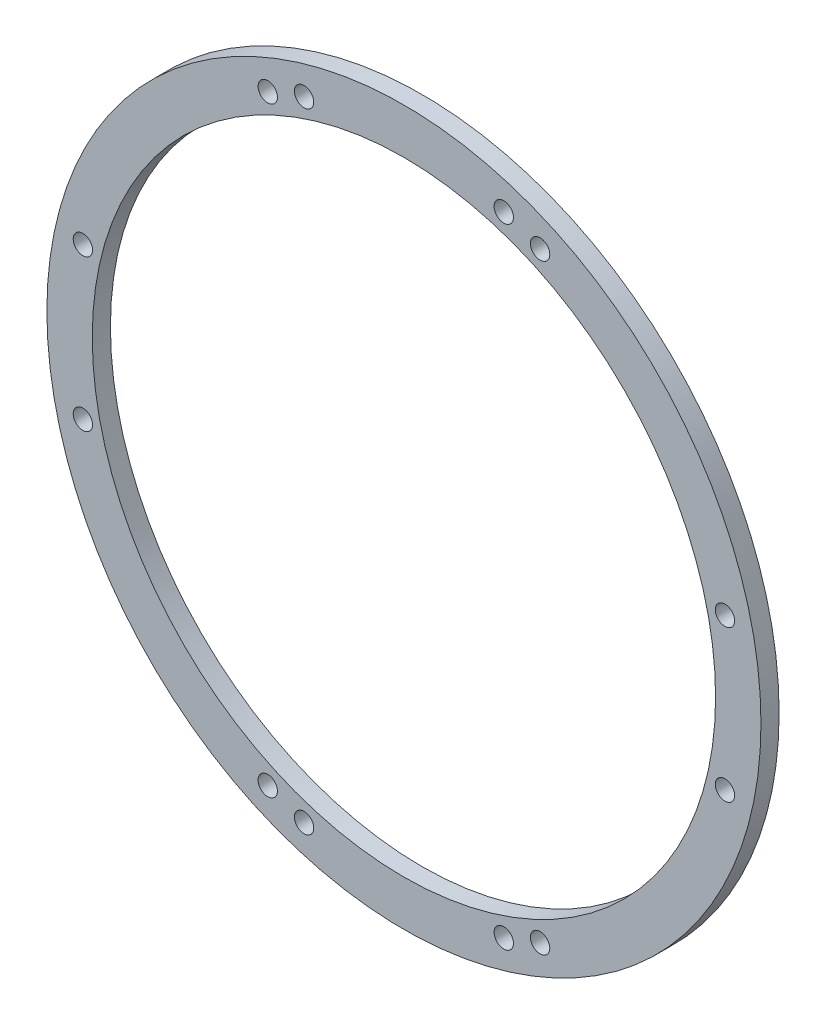
ISO-10303-21;
HEADER;
FILE_DESCRIPTION(('STEP AP214'),'2;1');
FILE_NAME('part.step','',(''),(''),'','','');
FILE_SCHEMA(('AUTOMOTIVE_DESIGN { 1 0 10303 214 1 1 1 1 }'));
ENDSEC;
DATA;
#1=APPLICATION_CONTEXT('core data for automotive mechanical design processes');
#2=APPLICATION_PROTOCOL_DEFINITION('international standard','automotive_design',2000,#1);
#3=PRODUCT_CONTEXT('',#1,'mechanical');
#4=PRODUCT('Part','Part','',(#3));
#5=PRODUCT_RELATED_PRODUCT_CATEGORY('part','',(#4));
#6=PRODUCT_DEFINITION_FORMATION('','',#4);
#7=PRODUCT_DEFINITION_CONTEXT('part definition',#1,'design');
#8=PRODUCT_DEFINITION('design','',#6,#7);
#9=PRODUCT_DEFINITION_SHAPE('','',#8);
#10=(LENGTH_UNIT() NAMED_UNIT(*) SI_UNIT(.MILLI.,.METRE.));
#11=(NAMED_UNIT(*) PLANE_ANGLE_UNIT() SI_UNIT($,.RADIAN.));
#12=(NAMED_UNIT(*) SI_UNIT($,.STERADIAN.) SOLID_ANGLE_UNIT());
#13=UNCERTAINTY_MEASURE_WITH_UNIT(LENGTH_MEASURE(1.E-05),#10,'distance_accuracy_value','');
#14=(GEOMETRIC_REPRESENTATION_CONTEXT(3) GLOBAL_UNCERTAINTY_ASSIGNED_CONTEXT((#13)) GLOBAL_UNIT_ASSIGNED_CONTEXT((#10,
#11,#12)) REPRESENTATION_CONTEXT('',''));
#15=CARTESIAN_POINT('',(0.,0.,0.));
#16=DIRECTION('',(0.,0.,1.));
#17=DIRECTION('',(1.,0.,0.));
#18=AXIS2_PLACEMENT_3D('',#15,#16,#17);
#19=CARTESIAN_POINT('',(0.,0.,3.));
#20=DIRECTION('',(0.,0.,1.));
#21=DIRECTION('',(1.,0.,0.));
#22=AXIS2_PLACEMENT_3D('',#19,#20,#21);
#23=PLANE('',#22);
#24=CARTESIAN_POINT('',(-22.5,49.6386945839634,3.));
#25=DIRECTION('',(0.,0.,1.));
#26=DIRECTION('',(-1.,0.,0.));
#27=AXIS2_PLACEMENT_3D('',#24,#25,#26);
#28=CIRCLE('',#27,1.6);
#29=CARTESIAN_POINT('',(-24.1,49.6386945839634,3.));
#30=VERTEX_POINT('',#29);
#31=EDGE_CURVE('E142',#30,#30,#28,.T.);
#32=ORIENTED_EDGE('',*,*,#31,.F.);
#33=EDGE_LOOP('',(#32));
#34=FACE_BOUND('',#33,.T.);
#35=CARTESIAN_POINT('',(-53.0471488394994,-12.5,3.));
#36=DIRECTION('',(0.,0.,1.));
#37=DIRECTION('',(1.,0.,0.));
#38=AXIS2_PLACEMENT_3D('',#35,#36,#37);
#39=CIRCLE('',#38,1.6);
#40=CARTESIAN_POINT('',(-51.4471488394994,-12.5,3.));
#41=VERTEX_POINT('',#40);
#42=EDGE_CURVE('E126',#41,#41,#39,.T.);
#43=ORIENTED_EDGE('',*,*,#42,.F.);
#44=EDGE_LOOP('',(#43));
#45=FACE_BOUND('',#44,.T.);
#46=CARTESIAN_POINT('',(-16.5,-51.9422756528822,3.));
#47=DIRECTION('',(0.,0.,1.));
#48=DIRECTION('',(1.,0.,0.));
#49=AXIS2_PLACEMENT_3D('',#46,#47,#48);
#50=CIRCLE('',#49,1.6);
#51=CARTESIAN_POINT('',(-14.9,-51.9422756528822,3.));
#52=VERTEX_POINT('',#51);
#53=EDGE_CURVE('E110',#52,#52,#50,.T.);
#54=ORIENTED_EDGE('',*,*,#53,.F.);
#55=EDGE_LOOP('',(#54));
#56=FACE_BOUND('',#55,.T.);
#57=CARTESIAN_POINT('',(16.5,-51.9422756528822,3.));
#58=DIRECTION('',(0.,0.,1.));
#59=DIRECTION('',(-1.,0.,0.));
#60=AXIS2_PLACEMENT_3D('',#57,#58,#59);
#61=CIRCLE('',#60,1.60000000000001);
#62=CARTESIAN_POINT('',(14.9,-51.9422756528822,3.));
#63=VERTEX_POINT('',#62);
#64=EDGE_CURVE('E94',#63,#63,#61,.T.);
#65=ORIENTED_EDGE('',*,*,#64,.F.);
#66=EDGE_LOOP('',(#65));
#67=FACE_BOUND('',#66,.T.);
#68=CARTESIAN_POINT('',(53.0471488394994,12.5,3.));
#69=DIRECTION('',(0.,0.,1.));
#70=DIRECTION('',(1.,0.,0.));
#71=AXIS2_PLACEMENT_3D('',#68,#69,#70);
#72=CIRCLE('',#71,1.6);
#73=CARTESIAN_POINT('',(54.6471488394994,12.5,3.));
#74=VERTEX_POINT('',#73);
#75=EDGE_CURVE('E78',#74,#74,#72,.T.);
#76=ORIENTED_EDGE('',*,*,#75,.F.);
#77=EDGE_LOOP('',(#76));
#78=FACE_BOUND('',#77,.T.);
#79=CARTESIAN_POINT('',(16.5,51.9422756528822,3.));
#80=DIRECTION('',(0.,0.,1.));
#81=DIRECTION('',(1.,0.,0.));
#82=AXIS2_PLACEMENT_3D('',#79,#80,#81);
#83=CIRCLE('',#82,1.60000000000001);
#84=CARTESIAN_POINT('',(18.1,51.9422756528822,3.));
#85=VERTEX_POINT('',#84);
#86=EDGE_CURVE('E62',#85,#85,#83,.T.);
#87=ORIENTED_EDGE('',*,*,#86,.F.);
#88=EDGE_LOOP('',(#87));
#89=FACE_BOUND('',#88,.T.);
#90=CARTESIAN_POINT('',(0.,0.,3.));
#91=DIRECTION('',(0.,0.,1.));
#92=DIRECTION('',(1.,0.,0.));
#93=AXIS2_PLACEMENT_3D('',#90,#91,#92);
#94=CIRCLE('',#93,59.);
#95=CARTESIAN_POINT('',(59.,0.,3.));
#96=VERTEX_POINT('',#95);
#97=EDGE_CURVE('E10',#96,#96,#94,.T.);
#98=ORIENTED_EDGE('',*,*,#97,.T.);
#99=EDGE_LOOP('',(#98));
#100=FACE_BOUND('',#99,.T.);
#101=CARTESIAN_POINT('',(0.,0.,3.));
#102=DIRECTION('',(0.,0.,1.));
#103=DIRECTION('',(1.,0.,0.));
#104=AXIS2_PLACEMENT_3D('',#101,#102,#103);
#105=CIRCLE('',#104,51.5);
#106=CARTESIAN_POINT('',(51.5,0.,3.));
#107=VERTEX_POINT('',#106);
#108=EDGE_CURVE('E56',#107,#107,#105,.T.);
#109=ORIENTED_EDGE('',*,*,#108,.F.);
#110=EDGE_LOOP('',(#109));
#111=FACE_BOUND('',#110,.T.);
#112=CARTESIAN_POINT('',(22.5,49.6386945839634,3.));
#113=DIRECTION('',(0.,0.,1.));
#114=DIRECTION('',(1.,0.,0.));
#115=AXIS2_PLACEMENT_3D('',#112,#113,#114);
#116=CIRCLE('',#115,1.6);
#117=CARTESIAN_POINT('',(24.1,49.6386945839634,3.));
#118=VERTEX_POINT('',#117);
#119=EDGE_CURVE('E70',#118,#118,#116,.T.);
#120=ORIENTED_EDGE('',*,*,#119,.F.);
#121=EDGE_LOOP('',(#120));
#122=FACE_BOUND('',#121,.T.);
#123=CARTESIAN_POINT('',(22.5,-49.6386945839634,3.));
#124=DIRECTION('',(0.,0.,1.));
#125=DIRECTION('',(-1.,0.,0.));
#126=AXIS2_PLACEMENT_3D('',#123,#124,#125);
#127=CIRCLE('',#126,1.6);
#128=CARTESIAN_POINT('',(20.9,-49.6386945839634,3.));
#129=VERTEX_POINT('',#128);
#130=EDGE_CURVE('E86',#129,#129,#127,.T.);
#131=ORIENTED_EDGE('',*,*,#130,.F.);
#132=EDGE_LOOP('',(#131));
#133=FACE_BOUND('',#132,.T.);
#134=CARTESIAN_POINT('',(53.0471488394994,-12.5,3.));
#135=DIRECTION('',(0.,0.,1.));
#136=DIRECTION('',(-1.,0.,0.));
#137=AXIS2_PLACEMENT_3D('',#134,#135,#136);
#138=CIRCLE('',#137,1.6);
#139=CARTESIAN_POINT('',(51.4471488394994,-12.5,3.));
#140=VERTEX_POINT('',#139);
#141=EDGE_CURVE('E102',#140,#140,#138,.T.);
#142=ORIENTED_EDGE('',*,*,#141,.F.);
#143=EDGE_LOOP('',(#142));
#144=FACE_BOUND('',#143,.T.);
#145=CARTESIAN_POINT('',(-22.5,-49.6386945839634,3.));
#146=DIRECTION('',(0.,0.,1.));
#147=DIRECTION('',(1.,0.,0.));
#148=AXIS2_PLACEMENT_3D('',#145,#146,#147);
#149=CIRCLE('',#148,1.6);
#150=CARTESIAN_POINT('',(-20.9,-49.6386945839634,3.));
#151=VERTEX_POINT('',#150);
#152=EDGE_CURVE('E118',#151,#151,#149,.T.);
#153=ORIENTED_EDGE('',*,*,#152,.F.);
#154=EDGE_LOOP('',(#153));
#155=FACE_BOUND('',#154,.T.);
#156=CARTESIAN_POINT('',(-53.0471488394994,12.5,3.));
#157=DIRECTION('',(0.,0.,1.));
#158=DIRECTION('',(-1.,0.,0.));
#159=AXIS2_PLACEMENT_3D('',#156,#157,#158);
#160=CIRCLE('',#159,1.6);
#161=CARTESIAN_POINT('',(-54.6471488394994,12.5,3.));
#162=VERTEX_POINT('',#161);
#163=EDGE_CURVE('E134',#162,#162,#160,.T.);
#164=ORIENTED_EDGE('',*,*,#163,.F.);
#165=EDGE_LOOP('',(#164));
#166=FACE_BOUND('',#165,.T.);
#167=CARTESIAN_POINT('',(-16.5,51.9422756528822,3.));
#168=DIRECTION('',(0.,0.,1.));
#169=DIRECTION('',(-1.,0.,0.));
#170=AXIS2_PLACEMENT_3D('',#167,#168,#169);
#171=CIRCLE('',#170,1.6);
#172=CARTESIAN_POINT('',(-18.1,51.9422756528822,3.));
#173=VERTEX_POINT('',#172);
#174=EDGE_CURVE('E150',#173,#173,#171,.T.);
#175=ORIENTED_EDGE('',*,*,#174,.F.);
#176=EDGE_LOOP('',(#175));
#177=FACE_BOUND('',#176,.T.);
#178=ADVANCED_FACE('F43',(#34,#45,#56,#67,#78,#89,#100,#111,#122,#133,#144,#155,#166,#177),#23,.T.);
#179=CARTESIAN_POINT('',(0.,0.,0.));
#180=DIRECTION('',(0.,0.,1.));
#181=DIRECTION('',(1.,0.,0.));
#182=AXIS2_PLACEMENT_3D('',#179,#180,#181);
#183=PLANE('',#182);
#184=CARTESIAN_POINT('',(0.,0.,0.));
#185=DIRECTION('',(0.,0.,1.));
#186=DIRECTION('',(1.,0.,0.));
#187=AXIS2_PLACEMENT_3D('',#184,#185,#186);
#188=CIRCLE('',#187,59.);
#189=CARTESIAN_POINT('',(59.,0.,0.));
#190=VERTEX_POINT('',#189);
#191=EDGE_CURVE('E47',#190,#190,#188,.T.);
#192=ORIENTED_EDGE('',*,*,#191,.F.);
#193=EDGE_LOOP('',(#192));
#194=FACE_BOUND('',#193,.T.);
#195=CARTESIAN_POINT('',(0.,0.,0.));
#196=DIRECTION('',(0.,0.,1.));
#197=DIRECTION('',(1.,0.,0.));
#198=AXIS2_PLACEMENT_3D('',#195,#196,#197);
#199=CIRCLE('',#198,51.5);
#200=CARTESIAN_POINT('',(51.5,0.,0.));
#201=VERTEX_POINT('',#200);
#202=EDGE_CURVE('E58',#201,#201,#199,.T.);
#203=ORIENTED_EDGE('',*,*,#202,.T.);
#204=EDGE_LOOP('',(#203));
#205=FACE_BOUND('',#204,.T.);
#206=CARTESIAN_POINT('',(16.5,51.9422756528822,0.));
#207=DIRECTION('',(0.,0.,1.));
#208=DIRECTION('',(1.,0.,0.));
#209=AXIS2_PLACEMENT_3D('',#206,#207,#208);
#210=CIRCLE('',#209,1.60000000000001);
#211=CARTESIAN_POINT('',(18.1,51.9422756528822,0.));
#212=VERTEX_POINT('',#211);
#213=EDGE_CURVE('E66',#212,#212,#210,.T.);
#214=ORIENTED_EDGE('',*,*,#213,.T.);
#215=EDGE_LOOP('',(#214));
#216=FACE_BOUND('',#215,.T.);
#217=CARTESIAN_POINT('',(22.5,49.6386945839634,0.));
#218=DIRECTION('',(0.,0.,1.));
#219=DIRECTION('',(1.,0.,0.));
#220=AXIS2_PLACEMENT_3D('',#217,#218,#219);
#221=CIRCLE('',#220,1.6);
#222=CARTESIAN_POINT('',(24.1,49.6386945839634,0.));
#223=VERTEX_POINT('',#222);
#224=EDGE_CURVE('E74',#223,#223,#221,.T.);
#225=ORIENTED_EDGE('',*,*,#224,.T.);
#226=EDGE_LOOP('',(#225));
#227=FACE_BOUND('',#226,.T.);
#228=CARTESIAN_POINT('',(53.0471488394994,12.5,0.));
#229=DIRECTION('',(0.,0.,1.));
#230=DIRECTION('',(1.,0.,0.));
#231=AXIS2_PLACEMENT_3D('',#228,#229,#230);
#232=CIRCLE('',#231,1.6);
#233=CARTESIAN_POINT('',(54.6471488394994,12.5,0.));
#234=VERTEX_POINT('',#233);
#235=EDGE_CURVE('E82',#234,#234,#232,.T.);
#236=ORIENTED_EDGE('',*,*,#235,.T.);
#237=EDGE_LOOP('',(#236));
#238=FACE_BOUND('',#237,.T.);
#239=CARTESIAN_POINT('',(22.5,-49.6386945839634,0.));
#240=DIRECTION('',(0.,0.,1.));
#241=DIRECTION('',(-1.,0.,0.));
#242=AXIS2_PLACEMENT_3D('',#239,#240,#241);
#243=CIRCLE('',#242,1.6);
#244=CARTESIAN_POINT('',(20.9,-49.6386945839634,0.));
#245=VERTEX_POINT('',#244);
#246=EDGE_CURVE('E90',#245,#245,#243,.T.);
#247=ORIENTED_EDGE('',*,*,#246,.T.);
#248=EDGE_LOOP('',(#247));
#249=FACE_BOUND('',#248,.T.);
#250=CARTESIAN_POINT('',(16.5,-51.9422756528822,0.));
#251=DIRECTION('',(0.,0.,1.));
#252=DIRECTION('',(-1.,0.,0.));
#253=AXIS2_PLACEMENT_3D('',#250,#251,#252);
#254=CIRCLE('',#253,1.60000000000001);
#255=CARTESIAN_POINT('',(14.9,-51.9422756528822,0.));
#256=VERTEX_POINT('',#255);
#257=EDGE_CURVE('E98',#256,#256,#254,.T.);
#258=ORIENTED_EDGE('',*,*,#257,.T.);
#259=EDGE_LOOP('',(#258));
#260=FACE_BOUND('',#259,.T.);
#261=CARTESIAN_POINT('',(53.0471488394994,-12.5,0.));
#262=DIRECTION('',(0.,0.,1.));
#263=DIRECTION('',(-1.,0.,0.));
#264=AXIS2_PLACEMENT_3D('',#261,#262,#263);
#265=CIRCLE('',#264,1.6);
#266=CARTESIAN_POINT('',(51.4471488394994,-12.5,0.));
#267=VERTEX_POINT('',#266);
#268=EDGE_CURVE('E106',#267,#267,#265,.T.);
#269=ORIENTED_EDGE('',*,*,#268,.T.);
#270=EDGE_LOOP('',(#269));
#271=FACE_BOUND('',#270,.T.);
#272=CARTESIAN_POINT('',(-16.5,-51.9422756528822,0.));
#273=DIRECTION('',(0.,0.,1.));
#274=DIRECTION('',(1.,0.,0.));
#275=AXIS2_PLACEMENT_3D('',#272,#273,#274);
#276=CIRCLE('',#275,1.6);
#277=CARTESIAN_POINT('',(-14.9,-51.9422756528822,0.));
#278=VERTEX_POINT('',#277);
#279=EDGE_CURVE('E114',#278,#278,#276,.T.);
#280=ORIENTED_EDGE('',*,*,#279,.T.);
#281=EDGE_LOOP('',(#280));
#282=FACE_BOUND('',#281,.T.);
#283=CARTESIAN_POINT('',(-22.5,-49.6386945839634,0.));
#284=DIRECTION('',(0.,0.,1.));
#285=DIRECTION('',(1.,0.,0.));
#286=AXIS2_PLACEMENT_3D('',#283,#284,#285);
#287=CIRCLE('',#286,1.6);
#288=CARTESIAN_POINT('',(-20.9,-49.6386945839634,0.));
#289=VERTEX_POINT('',#288);
#290=EDGE_CURVE('E122',#289,#289,#287,.T.);
#291=ORIENTED_EDGE('',*,*,#290,.T.);
#292=EDGE_LOOP('',(#291));
#293=FACE_BOUND('',#292,.T.);
#294=CARTESIAN_POINT('',(-53.0471488394994,-12.5,0.));
#295=DIRECTION('',(0.,0.,1.));
#296=DIRECTION('',(1.,0.,0.));
#297=AXIS2_PLACEMENT_3D('',#294,#295,#296);
#298=CIRCLE('',#297,1.6);
#299=CARTESIAN_POINT('',(-51.4471488394994,-12.5,0.));
#300=VERTEX_POINT('',#299);
#301=EDGE_CURVE('E130',#300,#300,#298,.T.);
#302=ORIENTED_EDGE('',*,*,#301,.T.);
#303=EDGE_LOOP('',(#302));
#304=FACE_BOUND('',#303,.T.);
#305=CARTESIAN_POINT('',(-53.0471488394994,12.5,0.));
#306=DIRECTION('',(0.,0.,1.));
#307=DIRECTION('',(-1.,0.,0.));
#308=AXIS2_PLACEMENT_3D('',#305,#306,#307);
#309=CIRCLE('',#308,1.6);
#310=CARTESIAN_POINT('',(-54.6471488394994,12.5,0.));
#311=VERTEX_POINT('',#310);
#312=EDGE_CURVE('E138',#311,#311,#309,.T.);
#313=ORIENTED_EDGE('',*,*,#312,.T.);
#314=EDGE_LOOP('',(#313));
#315=FACE_BOUND('',#314,.T.);
#316=CARTESIAN_POINT('',(-22.5,49.6386945839634,0.));
#317=DIRECTION('',(0.,0.,1.));
#318=DIRECTION('',(-1.,0.,0.));
#319=AXIS2_PLACEMENT_3D('',#316,#317,#318);
#320=CIRCLE('',#319,1.6);
#321=CARTESIAN_POINT('',(-24.1,49.6386945839634,0.));
#322=VERTEX_POINT('',#321);
#323=EDGE_CURVE('E146',#322,#322,#320,.T.);
#324=ORIENTED_EDGE('',*,*,#323,.T.);
#325=EDGE_LOOP('',(#324));
#326=FACE_BOUND('',#325,.T.);
#327=CARTESIAN_POINT('',(-16.5,51.9422756528822,0.));
#328=DIRECTION('',(0.,0.,1.));
#329=DIRECTION('',(-1.,0.,0.));
#330=AXIS2_PLACEMENT_3D('',#327,#328,#329);
#331=CIRCLE('',#330,1.6);
#332=CARTESIAN_POINT('',(-18.1,51.9422756528822,0.));
#333=VERTEX_POINT('',#332);
#334=EDGE_CURVE('E154',#333,#333,#331,.T.);
#335=ORIENTED_EDGE('',*,*,#334,.T.);
#336=EDGE_LOOP('',(#335));
#337=FACE_BOUND('',#336,.T.);
#338=ADVANCED_FACE('F166',(#194,#205,#216,#227,#238,#249,#260,#271,#282,#293,#304,#315,#326,
#337),#183,.F.);
#339=CARTESIAN_POINT('',(0.,0.,3.));
#340=DIRECTION('',(0.,0.,-1.));
#341=DIRECTION('',(-1.,0.,0.));
#342=AXIS2_PLACEMENT_3D('',#339,#340,#341);
#343=CYLINDRICAL_SURFACE('',#342,59.);
#344=ORIENTED_EDGE('',*,*,#97,.F.);
#345=EDGE_LOOP('',(#344));
#346=FACE_BOUND('',#345,.T.);
#347=ORIENTED_EDGE('',*,*,#191,.T.);
#348=EDGE_LOOP('',(#347));
#349=FACE_BOUND('',#348,.T.);
#350=ADVANCED_FACE('F45',(#346,#349),#343,.T.);
#351=CARTESIAN_POINT('',(0.,0.,3.));
#352=DIRECTION('',(0.,0.,-1.));
#353=DIRECTION('',(-1.,0.,0.));
#354=AXIS2_PLACEMENT_3D('',#351,#352,#353);
#355=CYLINDRICAL_SURFACE('',#354,51.5);
#356=ORIENTED_EDGE('',*,*,#108,.T.);
#357=EDGE_LOOP('',(#356));
#358=FACE_BOUND('',#357,.T.);
#359=ORIENTED_EDGE('',*,*,#202,.F.);
#360=EDGE_LOOP('',(#359));
#361=FACE_BOUND('',#360,.T.);
#362=ADVANCED_FACE('F176',(#358,#361),#355,.F.);
#363=CARTESIAN_POINT('',(16.5,51.9422756528822,3.));
#364=DIRECTION('',(0.,0.,-1.));
#365=DIRECTION('',(-1.,0.,0.));
#366=AXIS2_PLACEMENT_3D('',#363,#364,#365);
#367=CYLINDRICAL_SURFACE('',#366,1.60000000000001);
#368=ORIENTED_EDGE('',*,*,#86,.T.);
#369=EDGE_LOOP('',(#368));
#370=FACE_BOUND('',#369,.T.);
#371=ORIENTED_EDGE('',*,*,#213,.F.);
#372=EDGE_LOOP('',(#371));
#373=FACE_BOUND('',#372,.T.);
#374=ADVANCED_FACE('F179',(#370,#373),#367,.F.);
#375=CARTESIAN_POINT('',(22.5,49.6386945839634,3.));
#376=DIRECTION('',(0.,0.,-1.));
#377=DIRECTION('',(-1.,0.,0.));
#378=AXIS2_PLACEMENT_3D('',#375,#376,#377);
#379=CYLINDRICAL_SURFACE('',#378,1.6);
#380=ORIENTED_EDGE('',*,*,#119,.T.);
#381=EDGE_LOOP('',(#380));
#382=FACE_BOUND('',#381,.T.);
#383=ORIENTED_EDGE('',*,*,#224,.F.);
#384=EDGE_LOOP('',(#383));
#385=FACE_BOUND('',#384,.T.);
#386=ADVANCED_FACE('F183',(#382,#385),#379,.F.);
#387=CARTESIAN_POINT('',(53.0471488394994,12.5,3.));
#388=DIRECTION('',(0.,0.,-1.));
#389=DIRECTION('',(-1.,0.,0.));
#390=AXIS2_PLACEMENT_3D('',#387,#388,#389);
#391=CYLINDRICAL_SURFACE('',#390,1.6);
#392=ORIENTED_EDGE('',*,*,#75,.T.);
#393=EDGE_LOOP('',(#392));
#394=FACE_BOUND('',#393,.T.);
#395=ORIENTED_EDGE('',*,*,#235,.F.);
#396=EDGE_LOOP('',(#395));
#397=FACE_BOUND('',#396,.T.);
#398=ADVANCED_FACE('F187',(#394,#397),#391,.F.);
#399=CARTESIAN_POINT('',(22.5,-49.6386945839634,3.));
#400=DIRECTION('',(0.,0.,-1.));
#401=DIRECTION('',(-1.,0.,0.));
#402=AXIS2_PLACEMENT_3D('',#399,#400,#401);
#403=CYLINDRICAL_SURFACE('',#402,1.6);
#404=ORIENTED_EDGE('',*,*,#130,.T.);
#405=EDGE_LOOP('',(#404));
#406=FACE_BOUND('',#405,.T.);
#407=ORIENTED_EDGE('',*,*,#246,.F.);
#408=EDGE_LOOP('',(#407));
#409=FACE_BOUND('',#408,.T.);
#410=ADVANCED_FACE('F191',(#406,#409),#403,.F.);
#411=CARTESIAN_POINT('',(16.5,-51.9422756528822,3.));
#412=DIRECTION('',(0.,0.,-1.));
#413=DIRECTION('',(-1.,0.,0.));
#414=AXIS2_PLACEMENT_3D('',#411,#412,#413);
#415=CYLINDRICAL_SURFACE('',#414,1.60000000000001);
#416=ORIENTED_EDGE('',*,*,#64,.T.);
#417=EDGE_LOOP('',(#416));
#418=FACE_BOUND('',#417,.T.);
#419=ORIENTED_EDGE('',*,*,#257,.F.);
#420=EDGE_LOOP('',(#419));
#421=FACE_BOUND('',#420,.T.);
#422=ADVANCED_FACE('F195',(#418,#421),#415,.F.);
#423=CARTESIAN_POINT('',(53.0471488394994,-12.5,3.));
#424=DIRECTION('',(0.,0.,-1.));
#425=DIRECTION('',(-1.,0.,0.));
#426=AXIS2_PLACEMENT_3D('',#423,#424,#425);
#427=CYLINDRICAL_SURFACE('',#426,1.6);
#428=ORIENTED_EDGE('',*,*,#141,.T.);
#429=EDGE_LOOP('',(#428));
#430=FACE_BOUND('',#429,.T.);
#431=ORIENTED_EDGE('',*,*,#268,.F.);
#432=EDGE_LOOP('',(#431));
#433=FACE_BOUND('',#432,.T.);
#434=ADVANCED_FACE('F199',(#430,#433),#427,.F.);
#435=CARTESIAN_POINT('',(-16.5,-51.9422756528822,3.));
#436=DIRECTION('',(0.,0.,-1.));
#437=DIRECTION('',(-1.,0.,0.));
#438=AXIS2_PLACEMENT_3D('',#435,#436,#437);
#439=CYLINDRICAL_SURFACE('',#438,1.6);
#440=ORIENTED_EDGE('',*,*,#53,.T.);
#441=EDGE_LOOP('',(#440));
#442=FACE_BOUND('',#441,.T.);
#443=ORIENTED_EDGE('',*,*,#279,.F.);
#444=EDGE_LOOP('',(#443));
#445=FACE_BOUND('',#444,.T.);
#446=ADVANCED_FACE('F203',(#442,#445),#439,.F.);
#447=CARTESIAN_POINT('',(-22.5,-49.6386945839634,3.));
#448=DIRECTION('',(0.,0.,-1.));
#449=DIRECTION('',(-1.,0.,0.));
#450=AXIS2_PLACEMENT_3D('',#447,#448,#449);
#451=CYLINDRICAL_SURFACE('',#450,1.6);
#452=ORIENTED_EDGE('',*,*,#152,.T.);
#453=EDGE_LOOP('',(#452));
#454=FACE_BOUND('',#453,.T.);
#455=ORIENTED_EDGE('',*,*,#290,.F.);
#456=EDGE_LOOP('',(#455));
#457=FACE_BOUND('',#456,.T.);
#458=ADVANCED_FACE('F207',(#454,#457),#451,.F.);
#459=CARTESIAN_POINT('',(-53.0471488394994,-12.5,3.));
#460=DIRECTION('',(0.,0.,-1.));
#461=DIRECTION('',(-1.,0.,0.));
#462=AXIS2_PLACEMENT_3D('',#459,#460,#461);
#463=CYLINDRICAL_SURFACE('',#462,1.6);
#464=ORIENTED_EDGE('',*,*,#42,.T.);
#465=EDGE_LOOP('',(#464));
#466=FACE_BOUND('',#465,.T.);
#467=ORIENTED_EDGE('',*,*,#301,.F.);
#468=EDGE_LOOP('',(#467));
#469=FACE_BOUND('',#468,.T.);
#470=ADVANCED_FACE('F211',(#466,#469),#463,.F.);
#471=CARTESIAN_POINT('',(-53.0471488394994,12.5,3.));
#472=DIRECTION('',(0.,0.,-1.));
#473=DIRECTION('',(-1.,0.,0.));
#474=AXIS2_PLACEMENT_3D('',#471,#472,#473);
#475=CYLINDRICAL_SURFACE('',#474,1.6);
#476=ORIENTED_EDGE('',*,*,#163,.T.);
#477=EDGE_LOOP('',(#476));
#478=FACE_BOUND('',#477,.T.);
#479=ORIENTED_EDGE('',*,*,#312,.F.);
#480=EDGE_LOOP('',(#479));
#481=FACE_BOUND('',#480,.T.);
#482=ADVANCED_FACE('F215',(#478,#481),#475,.F.);
#483=CARTESIAN_POINT('',(-22.5,49.6386945839634,3.));
#484=DIRECTION('',(0.,0.,-1.));
#485=DIRECTION('',(-1.,0.,0.));
#486=AXIS2_PLACEMENT_3D('',#483,#484,#485);
#487=CYLINDRICAL_SURFACE('',#486,1.6);
#488=ORIENTED_EDGE('',*,*,#31,.T.);
#489=EDGE_LOOP('',(#488));
#490=FACE_BOUND('',#489,.T.);
#491=ORIENTED_EDGE('',*,*,#323,.F.);
#492=EDGE_LOOP('',(#491));
#493=FACE_BOUND('',#492,.T.);
#494=ADVANCED_FACE('F219',(#490,#493),#487,.F.);
#495=CARTESIAN_POINT('',(-16.5,51.9422756528822,3.));
#496=DIRECTION('',(0.,0.,-1.));
#497=DIRECTION('',(-1.,0.,0.));
#498=AXIS2_PLACEMENT_3D('',#495,#496,#497);
#499=CYLINDRICAL_SURFACE('',#498,1.6);
#500=ORIENTED_EDGE('',*,*,#174,.T.);
#501=EDGE_LOOP('',(#500));
#502=FACE_BOUND('',#501,.T.);
#503=ORIENTED_EDGE('',*,*,#334,.F.);
#504=EDGE_LOOP('',(#503));
#505=FACE_BOUND('',#504,.T.);
#506=ADVANCED_FACE('F162',(#502,#505),#499,.F.);
#507=CLOSED_SHELL('',(#178,#338,#350,#362,#374,#386,#398,#410,#422,#434,#446,#458,#470,#482,
#494,#506));
#508=MANIFOLD_SOLID_BREP('B2',#507);
#509=ADVANCED_BREP_SHAPE_REPRESENTATION('',(#18,#508),#14);
#510=SHAPE_DEFINITION_REPRESENTATION(#9,#509);
ENDSEC;
END-ISO-10303-21;
